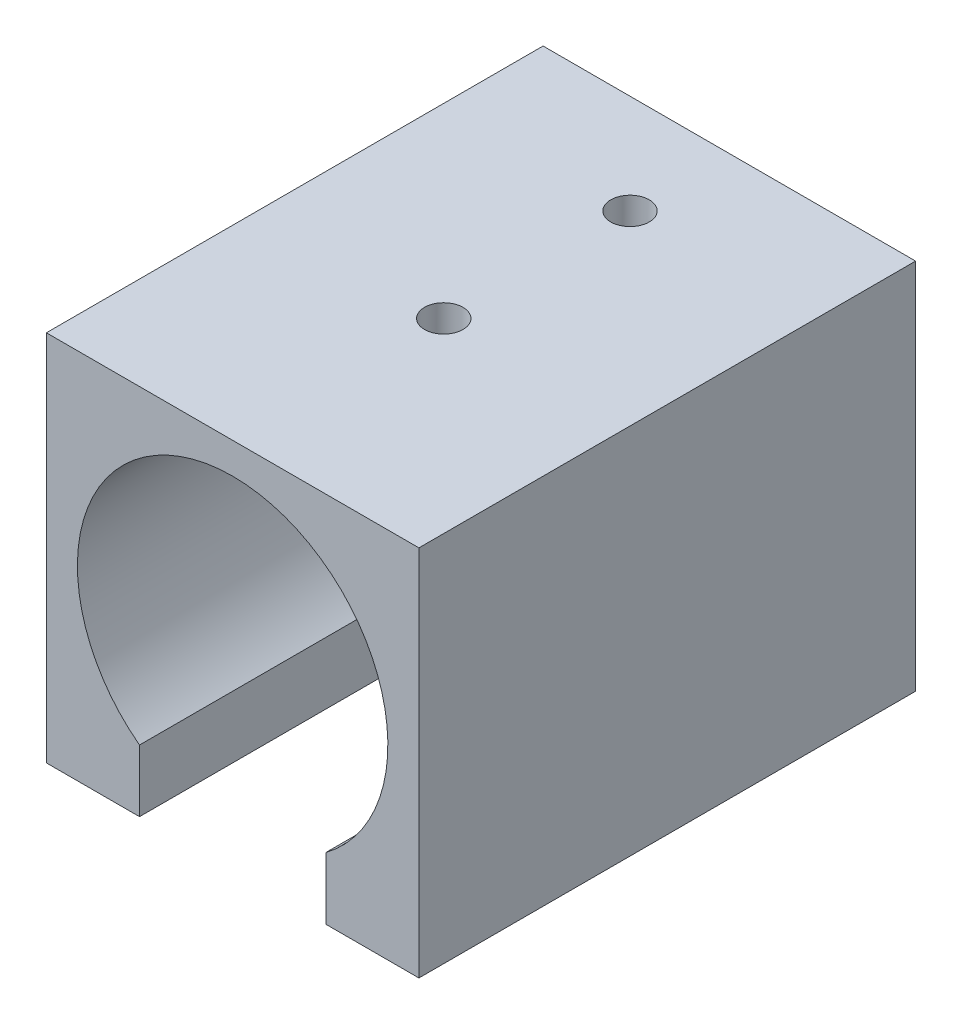
ISO-10303-21;
HEADER;
FILE_DESCRIPTION(('STEP AP214'),'2;1');
FILE_NAME('part.step','',(''),(''),'','','');
FILE_SCHEMA(('AUTOMOTIVE_DESIGN { 1 0 10303 214 1 1 1 1 }'));
ENDSEC;
DATA;
#1=APPLICATION_CONTEXT('core data for automotive mechanical design processes');
#2=APPLICATION_PROTOCOL_DEFINITION('international standard','automotive_design',2000,#1);
#3=PRODUCT_CONTEXT('',#1,'mechanical');
#4=PRODUCT('Part','Part','',(#3));
#5=PRODUCT_RELATED_PRODUCT_CATEGORY('part','',(#4));
#6=PRODUCT_DEFINITION_FORMATION('','',#4);
#7=PRODUCT_DEFINITION_CONTEXT('part definition',#1,'design');
#8=PRODUCT_DEFINITION('design','',#6,#7);
#9=PRODUCT_DEFINITION_SHAPE('','',#8);
#10=(LENGTH_UNIT() NAMED_UNIT(*) SI_UNIT(.MILLI.,.METRE.));
#11=(NAMED_UNIT(*) PLANE_ANGLE_UNIT() SI_UNIT($,.RADIAN.));
#12=(NAMED_UNIT(*) SI_UNIT($,.STERADIAN.) SOLID_ANGLE_UNIT());
#13=UNCERTAINTY_MEASURE_WITH_UNIT(LENGTH_MEASURE(1.E-05),#10,'distance_accuracy_value','');
#14=(GEOMETRIC_REPRESENTATION_CONTEXT(3) GLOBAL_UNCERTAINTY_ASSIGNED_CONTEXT((#13)) GLOBAL_UNIT_ASSIGNED_CONTEXT((#10,
#11,#12)) REPRESENTATION_CONTEXT('',''));
#15=CARTESIAN_POINT('',(0.,0.,0.));
#16=DIRECTION('',(0.,0.,1.));
#17=DIRECTION('',(1.,0.,0.));
#18=AXIS2_PLACEMENT_3D('',#15,#16,#17);
#19=CARTESIAN_POINT('',(-15.,15.,20.));
#20=DIRECTION('',(1.,0.,0.));
#21=DIRECTION('',(0.,0.,-1.));
#22=AXIS2_PLACEMENT_3D('',#19,#20,#21);
#23=PLANE('',#22);
#24=DIRECTION('',(0.,-1.,0.));
#25=VECTOR('',#24,1.);
#26=CARTESIAN_POINT('',(-15.,15.,-20.));
#27=LINE('',#26,#25);
#28=CARTESIAN_POINT('',(-15.,15.,-20.));
#29=VERTEX_POINT('',#28);
#30=CARTESIAN_POINT('',(-15.,-15.,-20.));
#31=VERTEX_POINT('',#30);
#32=EDGE_CURVE('E140',#29,#31,#27,.T.);
#33=ORIENTED_EDGE('',*,*,#32,.T.);
#34=DIRECTION('',(0.,0.,-1.));
#35=VECTOR('',#34,1.);
#36=CARTESIAN_POINT('',(-15.,-15.,20.));
#37=LINE('',#36,#35);
#38=CARTESIAN_POINT('',(-15.,-15.,20.));
#39=VERTEX_POINT('',#38);
#40=EDGE_CURVE('E11',#39,#31,#37,.T.);
#41=ORIENTED_EDGE('',*,*,#40,.F.);
#42=DIRECTION('',(0.,-1.,0.));
#43=VECTOR('',#42,1.);
#44=CARTESIAN_POINT('',(-15.,15.,20.));
#45=LINE('',#44,#43);
#46=CARTESIAN_POINT('',(-15.,15.,20.));
#47=VERTEX_POINT('',#46);
#48=EDGE_CURVE('E163',#47,#39,#45,.T.);
#49=ORIENTED_EDGE('',*,*,#48,.F.);
#50=DIRECTION('',(0.,0.,-1.));
#51=VECTOR('',#50,1.);
#52=CARTESIAN_POINT('',(-15.,15.,20.));
#53=LINE('',#52,#51);
#54=EDGE_CURVE('E136',#47,#29,#53,.T.);
#55=ORIENTED_EDGE('',*,*,#54,.T.);
#56=EDGE_LOOP('',(#33,#41,#49,#55));
#57=FACE_BOUND('',#56,.T.);
#58=ADVANCED_FACE('F39',(#57),#23,.F.);
#59=CARTESIAN_POINT('',(-15.,-15.,20.));
#60=DIRECTION('',(0.,1.,0.));
#61=DIRECTION('',(0.,0.,1.));
#62=AXIS2_PLACEMENT_3D('',#59,#60,#61);
#63=PLANE('',#62);
#64=DIRECTION('',(1.,0.,0.));
#65=VECTOR('',#64,1.);
#66=CARTESIAN_POINT('',(-15.,-15.,-20.));
#67=LINE('',#66,#65);
#68=CARTESIAN_POINT('',(-7.50000000000001,-15.,-20.));
#69=VERTEX_POINT('',#68);
#70=EDGE_CURVE('E144',#31,#69,#67,.T.);
#71=ORIENTED_EDGE('',*,*,#70,.T.);
#72=DIRECTION('',(0.,0.,-1.));
#73=VECTOR('',#72,1.);
#74=CARTESIAN_POINT('',(-7.50000000000001,-15.,20.));
#75=LINE('',#74,#73);
#76=CARTESIAN_POINT('',(-7.50000000000001,-15.,20.));
#77=VERTEX_POINT('',#76);
#78=EDGE_CURVE('E48',#77,#69,#75,.T.);
#79=ORIENTED_EDGE('',*,*,#78,.F.);
#80=DIRECTION('',(1.,0.,0.));
#81=VECTOR('',#80,1.);
#82=CARTESIAN_POINT('',(-15.,-15.,20.));
#83=LINE('',#82,#81);
#84=EDGE_CURVE('E99',#39,#77,#83,.T.);
#85=ORIENTED_EDGE('',*,*,#84,.F.);
#86=ORIENTED_EDGE('',*,*,#40,.T.);
#87=EDGE_LOOP('',(#71,#79,#85,#86));
#88=FACE_BOUND('',#87,.T.);
#89=ADVANCED_FACE('F242',(#88),#63,.F.);
#90=CARTESIAN_POINT('',(-7.50000000000001,-15.,20.));
#91=DIRECTION('',(-1.,0.,0.));
#92=DIRECTION('',(0.,0.,1.));
#93=AXIS2_PLACEMENT_3D('',#90,#91,#92);
#94=PLANE('',#93);
#95=DIRECTION('',(0.,1.,0.));
#96=VECTOR('',#95,1.);
#97=CARTESIAN_POINT('',(-7.50000000000001,-15.,-20.));
#98=LINE('',#97,#96);
#99=CARTESIAN_POINT('',(-7.50000000000001,-10.,-20.));
#100=VERTEX_POINT('',#99);
#101=EDGE_CURVE('E148',#69,#100,#98,.T.);
#102=ORIENTED_EDGE('',*,*,#101,.T.);
#103=DIRECTION('',(0.,0.,-1.));
#104=VECTOR('',#103,1.);
#105=CARTESIAN_POINT('',(-7.50000000000001,-10.,20.));
#106=LINE('',#105,#104);
#107=CARTESIAN_POINT('',(-7.50000000000001,-10.,20.));
#108=VERTEX_POINT('',#107);
#109=EDGE_CURVE('E174',#108,#100,#106,.T.);
#110=ORIENTED_EDGE('',*,*,#109,.F.);
#111=DIRECTION('',(0.,1.,0.));
#112=VECTOR('',#111,1.);
#113=CARTESIAN_POINT('',(-7.50000000000001,-15.,20.));
#114=LINE('',#113,#112);
#115=EDGE_CURVE('E184',#77,#108,#114,.T.);
#116=ORIENTED_EDGE('',*,*,#115,.F.);
#117=ORIENTED_EDGE('',*,*,#78,.T.);
#118=EDGE_LOOP('',(#102,#110,#116,#117));
#119=FACE_BOUND('',#118,.T.);
#120=ADVANCED_FACE('F182',(#119),#94,.F.);
#121=CARTESIAN_POINT('',(0.,0.,20.));
#122=DIRECTION('',(0.,0.,-1.));
#123=DIRECTION('',(-1.,0.,0.));
#124=AXIS2_PLACEMENT_3D('',#121,#122,#123);
#125=CYLINDRICAL_SURFACE('',#124,12.5);
#126=CARTESIAN_POINT('',(0.,12.5,-10.45));
#127=CARTESIAN_POINT('',(-0.0867072251236057,12.499998798212,-10.4500036870948));
#128=CARTESIAN_POINT('',(-0.173468771035089,12.4990882922832,-10.4573001512064));
#129=CARTESIAN_POINT('',(-0.344577980164189,12.495543683525,-10.4862922209141));
#130=CARTESIAN_POINT('',(-0.428923020275001,12.492907776648,-10.508002898086));
#131=CARTESIAN_POINT('',(-0.592697259859221,12.4862093415402,-10.5651742493805));
#132=CARTESIAN_POINT('',(-0.672129711980406,12.4821477694049,-10.6006257101613));
#133=CARTESIAN_POINT('',(-0.823902461956769,12.4730498401483,-10.6842522420837));
#134=CARTESIAN_POINT('',(-0.896243981963393,12.4680136514527,-10.7324251153314));
#135=CARTESIAN_POINT('',(-1.03218871664407,12.4574983294599,-10.8404062671243));
#136=CARTESIAN_POINT('',(-1.09574795593556,12.4520171708152,-10.9002697175727));
#137=CARTESIAN_POINT('',(-1.2119452218765,12.4412460183527,-11.0298142944887));
#138=CARTESIAN_POINT('',(-1.26458269424667,12.4359560342482,-11.0994959189271));
#139=CARTESIAN_POINT('',(-1.35760570049989,12.4261462119652,-11.2469841683814));
#140=CARTESIAN_POINT('',(-1.39795009322905,12.4216289816005,-11.3248169301185));
#141=CARTESIAN_POINT('',(-1.46497897354807,12.4139027656364,-11.4862183274872));
#142=CARTESIAN_POINT('',(-1.49166397105521,12.4106937312018,-11.5697867488694));
#143=CARTESIAN_POINT('',(-1.53048308042555,12.4059665430619,-11.7398311814415));
#144=CARTESIAN_POINT('',(-1.54269139131005,12.4044397699495,-11.8262900100946));
#145=CARTESIAN_POINT('',(-1.55244016467469,12.4032235756294,-12.0000417683099));
#146=CARTESIAN_POINT('',(-1.5499812079234,12.4035340816725,-12.0873346647094));
#147=CARTESIAN_POINT('',(-1.53052616632211,12.4059494750666,-12.2597597738967));
#148=CARTESIAN_POINT('',(-1.51361178336124,12.4080442773759,-12.3449013666022));
#149=CARTESIAN_POINT('',(-1.4658534859347,12.4137765003307,-12.5111282526738));
#150=CARTESIAN_POINT('',(-1.43500929335627,12.4174139517756,-12.5922134650172));
#151=CARTESIAN_POINT('',(-1.3601790085877,12.425833064832,-12.7482798820333));
#152=CARTESIAN_POINT('',(-1.316157379434,12.4306178134474,-12.8232438742211));
#153=CARTESIAN_POINT('',(-1.21624726139146,12.4407900023634,-12.9647512978054));
#154=CARTESIAN_POINT('',(-1.16035823832513,12.4461774697885,-13.0312943499416));
#155=CARTESIAN_POINT('',(-1.03784686647303,12.456992898046,-13.1545452275453));
#156=CARTESIAN_POINT('',(-0.971154089015664,12.4624208850302,-13.2111830681271));
#157=CARTESIAN_POINT('',(-0.829170957767612,12.4726714494502,-13.3124709743132));
#158=CARTESIAN_POINT('',(-0.753880584686478,12.4774940255275,-13.3571210130196));
#159=CARTESIAN_POINT('',(-0.596785749902868,12.4859933199627,-13.4331657917932));
#160=CARTESIAN_POINT('',(-0.514979163128537,12.4896696625736,-13.4645561864066));
#161=CARTESIAN_POINT('',(-0.347200470469461,12.4954588398172,-13.5131352481587));
#162=CARTESIAN_POINT('',(-0.261228556665171,12.4975717464734,-13.5303245695089));
#163=CARTESIAN_POINT('',(-0.0881648024434582,12.4999866267437,-13.5499229217329));
#164=CARTESIAN_POINT('',(-0.00108403873556593,12.5003004131844,-13.5524283677436));
#165=CARTESIAN_POINT('',(0.172256134476634,12.4991135822208,-13.5428422365252));
#166=CARTESIAN_POINT('',(0.25851556114941,12.4976130028267,-13.5307509650904));
#167=CARTESIAN_POINT('',(0.42748025585421,12.4929734205319,-13.4923947168141));
#168=CARTESIAN_POINT('',(0.510196109809588,12.4898397286542,-13.466175675375));
#169=CARTESIAN_POINT('',(0.670056755182107,12.4822847940335,-13.4003558829238));
#170=CARTESIAN_POINT('',(0.747201360078995,12.4778635082082,-13.3607546841413));
#171=CARTESIAN_POINT('',(0.89416048353398,12.4681969325582,-13.2690611822642));
#172=CARTESIAN_POINT('',(0.963935789565004,12.4629475723442,-13.2169064688757));
#173=CARTESIAN_POINT('',(1.09377679018829,12.4522248923118,-13.1016747652346));
#174=CARTESIAN_POINT('',(1.15384210555621,12.4467515637568,-13.0385973485942));
#175=CARTESIAN_POINT('',(1.26289984778849,12.4361614192701,-12.9028862493772));
#176=CARTESIAN_POINT('',(1.31182839107227,12.4310467711594,-12.8302010360302));
#177=CARTESIAN_POINT('',(1.39678244848355,12.4217886269989,-12.6775878483497));
#178=CARTESIAN_POINT('',(1.43280821778949,12.4176451117437,-12.5976600172929));
#179=CARTESIAN_POINT('',(1.49083050862598,12.41081308791,-12.4330371497684));
#180=CARTESIAN_POINT('',(1.51286313591959,12.4081208374502,-12.3483550008969));
#181=CARTESIAN_POINT('',(1.54239002807794,12.4044853964649,-12.1764574455571));
#182=CARTESIAN_POINT('',(1.54988495763164,12.4035421259731,-12.0892421550936));
#183=CARTESIAN_POINT('',(1.5501116383166,12.403513747585,-11.9153895697689));
#184=CARTESIAN_POINT('',(1.54294375248331,12.4044160075247,-11.8287523906871));
#185=CARTESIAN_POINT('',(1.514260709308,12.4079498790944,-11.6579242426086));
#186=CARTESIAN_POINT('',(1.4927455496753,12.4105814910005,-11.5737332740025));
#187=CARTESIAN_POINT('',(1.43600991652796,12.4172736604911,-11.410200084614));
#188=CARTESIAN_POINT('',(1.40079419582845,12.4213337224901,-11.3308561933805));
#189=CARTESIAN_POINT('',(1.31766697307857,12.4304261524973,-11.1791878095651));
#190=CARTESIAN_POINT('',(1.26975532197685,12.4354585319204,-11.1068633994061));
#191=CARTESIAN_POINT('',(1.16222369368404,12.4459698451891,-10.9707738899086));
#192=CARTESIAN_POINT('',(1.1025289114333,12.4514514939396,-10.9070681037375));
#193=CARTESIAN_POINT('',(0.97328131979899,12.4622196903679,-10.7905392529694));
#194=CARTESIAN_POINT('',(0.903726187955631,12.4675061917109,-10.7377187594549));
#195=CARTESIAN_POINT('',(0.756434126245411,12.477310259318,-10.6442919631966));
#196=CARTESIAN_POINT('',(0.678667539364609,12.4818248726538,-10.6037321297325));
#197=CARTESIAN_POINT('',(0.517414719236202,12.4895464811727,-10.5363050632856));
#198=CARTESIAN_POINT('',(0.433934824141751,12.4927548987956,-10.5094229273529));
#199=CARTESIAN_POINT('',(0.291684386828074,12.4967277539594,-10.476560869821));
#200=CARTESIAN_POINT('',(0.23381143027536,12.4979488792959,-10.4666148276045));
#201=CARTESIAN_POINT('',(0.117300600307159,12.4995854059513,-10.4533331692661));
#202=CARTESIAN_POINT('',(0.0586627324130275,12.500000813083,-10.4499975054552));
#203=CARTESIAN_POINT('',(0.,12.5,-10.45));
#204=B_SPLINE_CURVE_WITH_KNOTS('',3,(#126,#127,#128,#129,#130,#131,#132,#133,#134,#135,#136,
#137,#138,#139,#140,#141,#142,#143,#144,#145,#146,#147,#148,#149,#150,#151,#152,#153,#154,#155,
#156,#157,#158,#159,#160,#161,#162,#163,#164,#165,#166,#167,#168,#169,#170,#171,#172,#173,#174,
#175,#176,#177,#178,#179,#180,#181,#182,#183,#184,#185,#186,#187,#188,#189,#190,#191,#192,#193,
#194,#195,#196,#197,#198,#199,#200,#201,#202,#203),.UNSPECIFIED.,.T.,.F.,(4,2,2,2,2,2,2,2,2,2,2,
2,2,2,2,2,2,2,2,2,2,2,2,2,2,2,2,2,2,2,2,2,2,2,2,2,2,2,4),(0.,0.259907401620541,
0.520086992663462,0.780092431472956,1.04005297818175,1.30127138528092,1.56250304596413,
1.82459960187755,2.08668637278128,2.34742395283558,2.608151208732,2.86741450993791,
3.12668298764101,3.38665705917449,3.64664283519419,3.90839720179665,4.17015215570972,
4.43199282559182,4.69382143238891,4.95392891489264,5.21403094836145,5.47329233783743,
5.73256240312442,5.99314907667814,6.25374592500451,6.51580193278843,6.77785275759922,
7.0392246497426,7.30058459122419,7.5601615807523,7.81973861172431,8.07922567388976,
8.33871578259101,8.59990955754065,8.86116495535942,9.1233984713476,9.38534564768428,
9.56119014424271,9.7370333722055),.UNSPECIFIED.);
#205=CARTESIAN_POINT('',(0.,12.5,-10.45));
#206=VERTEX_POINT('',#205);
#207=EDGE_CURVE('E145',#206,#206,#204,.T.);
#208=ORIENTED_EDGE('',*,*,#207,.F.);
#209=EDGE_LOOP('',(#208));
#210=FACE_BOUND('',#209,.T.);
#211=CARTESIAN_POINT('',(0.,12.5,4.55));
#212=CARTESIAN_POINT('',(-0.0867072251236056,12.499998798212,4.54999631290523));
#213=CARTESIAN_POINT('',(-0.173468771035089,12.4990882922832,4.54269984879357));
#214=CARTESIAN_POINT('',(-0.344577980164189,12.495543683525,4.5137077790859));
#215=CARTESIAN_POINT('',(-0.428923020275002,12.492907776648,4.49199710191398));
#216=CARTESIAN_POINT('',(-0.592697259859221,12.4862093415402,4.43482575061953));
#217=CARTESIAN_POINT('',(-0.672129711980406,12.4821477694049,4.39937428983871));
#218=CARTESIAN_POINT('',(-0.823902461956769,12.4730498401483,4.31574775791625));
#219=CARTESIAN_POINT('',(-0.896243981963393,12.4680136514527,4.26757488466856));
#220=CARTESIAN_POINT('',(-1.03218871664407,12.4574983294599,4.15959373287569));
#221=CARTESIAN_POINT('',(-1.09574795593556,12.4520171708152,4.09973028242726));
#222=CARTESIAN_POINT('',(-1.2119452218765,12.4412460183527,3.97018570551125));
#223=CARTESIAN_POINT('',(-1.26458269424667,12.4359560342482,3.90050408107289));
#224=CARTESIAN_POINT('',(-1.35760570049989,12.4261462119652,3.75301583161857));
#225=CARTESIAN_POINT('',(-1.39795009322905,12.4216289816005,3.67518306988146));
#226=CARTESIAN_POINT('',(-1.46497897354807,12.4139027656364,3.51378167251279));
#227=CARTESIAN_POINT('',(-1.49166397105521,12.4106937312018,3.43021325113057));
#228=CARTESIAN_POINT('',(-1.53048308042555,12.4059665430619,3.26016881855848));
#229=CARTESIAN_POINT('',(-1.54269139131005,12.4044397699495,3.17370998990537));
#230=CARTESIAN_POINT('',(-1.55244016467469,12.4032235756294,2.99995823169012));
#231=CARTESIAN_POINT('',(-1.5499812079234,12.4035340816725,2.91266533529058));
#232=CARTESIAN_POINT('',(-1.53052616632211,12.4059494750666,2.74024022610332));
#233=CARTESIAN_POINT('',(-1.51361178336124,12.4080442773759,2.65509863339782));
#234=CARTESIAN_POINT('',(-1.4658534859347,12.4137765003307,2.48887174732621));
#235=CARTESIAN_POINT('',(-1.43500929335627,12.4174139517756,2.40778653498284));
#236=CARTESIAN_POINT('',(-1.3601790085877,12.425833064832,2.25172011796672));
#237=CARTESIAN_POINT('',(-1.316157379434,12.4306178134474,2.1767561257789));
#238=CARTESIAN_POINT('',(-1.21624726139146,12.4407900023634,2.03524870219462));
#239=CARTESIAN_POINT('',(-1.16035823832513,12.4461774697885,1.96870565005844));
#240=CARTESIAN_POINT('',(-1.03784686647303,12.456992898046,1.84545477245472));
#241=CARTESIAN_POINT('',(-0.971154089015663,12.4624208850302,1.78881693187286));
#242=CARTESIAN_POINT('',(-0.829170957767611,12.4726714494502,1.68752902568678));
#243=CARTESIAN_POINT('',(-0.753880584686478,12.4774940255275,1.64287898698037));
#244=CARTESIAN_POINT('',(-0.596785749902867,12.4859933199627,1.56683420820677));
#245=CARTESIAN_POINT('',(-0.514979163128537,12.4896696625736,1.53544381359335));
#246=CARTESIAN_POINT('',(-0.34720047046946,12.4954588398172,1.48686475184133));
#247=CARTESIAN_POINT('',(-0.26122855666517,12.4975717464734,1.46967543049114));
#248=CARTESIAN_POINT('',(-0.0881648024434575,12.4999866267437,1.45007707826711));
#249=CARTESIAN_POINT('',(-0.00108403873556553,12.5003004131844,1.4475716322564));
#250=CARTESIAN_POINT('',(0.172256134476634,12.4991135822208,1.45715776347481));
#251=CARTESIAN_POINT('',(0.258515561149411,12.4976130028267,1.46924903490957));
#252=CARTESIAN_POINT('',(0.42748025585421,12.4929734205319,1.50760528318592));
#253=CARTESIAN_POINT('',(0.510196109809588,12.4898397286542,1.53382432462502));
#254=CARTESIAN_POINT('',(0.670056755182108,12.4822847940335,1.59964411707623));
#255=CARTESIAN_POINT('',(0.747201360078996,12.4778635082082,1.63924531585874));
#256=CARTESIAN_POINT('',(0.89416048353398,12.4681969325582,1.73093881773578));
#257=CARTESIAN_POINT('',(0.963935789565004,12.4629475723442,1.7830935311243));
#258=CARTESIAN_POINT('',(1.09377679018829,12.4522248923118,1.89832523476544));
#259=CARTESIAN_POINT('',(1.15384210555621,12.4467515637568,1.96140265140581));
#260=CARTESIAN_POINT('',(1.26289984778849,12.4361614192701,2.0971137506228));
#261=CARTESIAN_POINT('',(1.31182839107227,12.4310467711594,2.16979896396984));
#262=CARTESIAN_POINT('',(1.39678244848356,12.4217886269989,2.32241215165026));
#263=CARTESIAN_POINT('',(1.43280821778949,12.4176451117437,2.40233998270706));
#264=CARTESIAN_POINT('',(1.49083050862598,12.41081308791,2.56696285023156));
#265=CARTESIAN_POINT('',(1.51286313591959,12.4081208374502,2.6516449991031));
#266=CARTESIAN_POINT('',(1.54239002807794,12.4044853964649,2.82354255444287));
#267=CARTESIAN_POINT('',(1.54988495763164,12.4035421259731,2.91075784490637));
#268=CARTESIAN_POINT('',(1.5501116383166,12.403513747585,3.08461043023106));
#269=CARTESIAN_POINT('',(1.54294375248331,12.4044160075247,3.17124760931287));
#270=CARTESIAN_POINT('',(1.514260709308,12.4079498790944,3.34207575739137));
#271=CARTESIAN_POINT('',(1.4927455496753,12.4105814910005,3.4262667259975));
#272=CARTESIAN_POINT('',(1.43600991652796,12.4172736604911,3.58979991538602));
#273=CARTESIAN_POINT('',(1.40079419582845,12.4213337224901,3.6691438066195));
#274=CARTESIAN_POINT('',(1.31766697307856,12.4304261524973,3.8208121904349));
#275=CARTESIAN_POINT('',(1.26975532197685,12.4354585319204,3.89313660059388));
#276=CARTESIAN_POINT('',(1.16222369368404,12.4459698451891,4.02922611009145));
#277=CARTESIAN_POINT('',(1.1025289114333,12.4514514939396,4.09293189626252));
#278=CARTESIAN_POINT('',(0.973281319798991,12.4622196903679,4.20946074703056));
#279=CARTESIAN_POINT('',(0.903726187955631,12.4675061917109,4.26228124054513));
#280=CARTESIAN_POINT('',(0.756434126245411,12.477310259318,4.35570803680339));
#281=CARTESIAN_POINT('',(0.678667539364608,12.4818248726538,4.39626787026746));
#282=CARTESIAN_POINT('',(0.517414719236201,12.4895464811727,4.46369493671438));
#283=CARTESIAN_POINT('',(0.43393482414175,12.4927548987956,4.49057707264711));
#284=CARTESIAN_POINT('',(0.291684386828073,12.4967277539594,4.52343913017896));
#285=CARTESIAN_POINT('',(0.23381143027536,12.4979488792959,4.53338517239551));
#286=CARTESIAN_POINT('',(0.11730060030716,12.4995854059513,4.54666683073386));
#287=CARTESIAN_POINT('',(0.0586627324130277,12.500000813083,4.55000249454476));
#288=CARTESIAN_POINT('',(0.,12.5,4.55));
#289=B_SPLINE_CURVE_WITH_KNOTS('',3,(#211,#212,#213,#214,#215,#216,#217,#218,#219,#220,#221,
#222,#223,#224,#225,#226,#227,#228,#229,#230,#231,#232,#233,#234,#235,#236,#237,#238,#239,#240,
#241,#242,#243,#244,#245,#246,#247,#248,#249,#250,#251,#252,#253,#254,#255,#256,#257,#258,#259,
#260,#261,#262,#263,#264,#265,#266,#267,#268,#269,#270,#271,#272,#273,#274,#275,#276,#277,#278,
#279,#280,#281,#282,#283,#284,#285,#286,#287,#288),.UNSPECIFIED.,.T.,.F.,(4,2,2,2,2,2,2,2,2,2,2,
2,2,2,2,2,2,2,2,2,2,2,2,2,2,2,2,2,2,2,2,2,2,2,2,2,2,2,4),(0.,0.25990740162054,0.520086992663463,
0.780092431472957,1.04005297818175,1.30127138528093,1.56250304596414,1.82459960187755,
2.08668637278128,2.34742395283558,2.608151208732,2.86741450993791,3.12668298764101,
3.38665705917449,3.64664283519419,3.90839720179665,4.17015215570972,4.43199282559182,
4.69382143238891,4.95392891489264,5.21403094836145,5.47329233783743,5.73256240312442,
5.99314907667814,6.25374592500452,6.51580193278843,6.77785275759923,7.03922464974261,
7.30058459122419,7.5601615807523,7.81973861172431,8.07922567388977,8.33871578259101,
8.59990955754065,8.86116495535942,9.1233984713476,9.38534564768428,9.56119014424271,
9.7370333722055),.UNSPECIFIED.);
#290=CARTESIAN_POINT('',(0.,12.5,4.55));
#291=VERTEX_POINT('',#290);
#292=EDGE_CURVE('E207',#291,#291,#289,.T.);
#293=ORIENTED_EDGE('',*,*,#292,.F.);
#294=EDGE_LOOP('',(#293));
#295=FACE_BOUND('',#294,.T.);
#296=CARTESIAN_POINT('',(0.,0.,-20.));
#297=DIRECTION('',(0.,0.,-1.));
#298=DIRECTION('',(-1.,0.,0.));
#299=AXIS2_PLACEMENT_3D('',#296,#297,#298);
#300=CIRCLE('',#299,12.5);
#301=CARTESIAN_POINT('',(7.50000000000001,-10.,-20.));
#302=VERTEX_POINT('',#301);
#303=EDGE_CURVE('E151',#100,#302,#300,.T.);
#304=ORIENTED_EDGE('',*,*,#303,.T.);
#305=DIRECTION('',(0.,0.,-1.));
#306=VECTOR('',#305,1.);
#307=CARTESIAN_POINT('',(7.50000000000001,-10.,20.));
#308=LINE('',#307,#306);
#309=CARTESIAN_POINT('',(7.50000000000001,-10.,20.));
#310=VERTEX_POINT('',#309);
#311=EDGE_CURVE('E170',#310,#302,#308,.T.);
#312=ORIENTED_EDGE('',*,*,#311,.F.);
#313=CARTESIAN_POINT('',(0.,0.,20.));
#314=DIRECTION('',(0.,0.,-1.));
#315=DIRECTION('',(-1.,0.,0.));
#316=AXIS2_PLACEMENT_3D('',#313,#314,#315);
#317=CIRCLE('',#316,12.5);
#318=EDGE_CURVE('E197',#108,#310,#317,.T.);
#319=ORIENTED_EDGE('',*,*,#318,.F.);
#320=ORIENTED_EDGE('',*,*,#109,.T.);
#321=EDGE_LOOP('',(#304,#312,#319,#320));
#322=FACE_BOUND('',#321,.T.);
#323=ADVANCED_FACE('F192',(#210,#295,#322),#125,.F.);
#324=CARTESIAN_POINT('',(7.50000000000001,-15.,20.));
#325=DIRECTION('',(1.,0.,0.));
#326=DIRECTION('',(0.,0.,-1.));
#327=AXIS2_PLACEMENT_3D('',#324,#325,#326);
#328=PLANE('',#327);
#329=DIRECTION('',(0.,-1.,0.));
#330=VECTOR('',#329,1.);
#331=CARTESIAN_POINT('',(7.50000000000001,-15.,-20.));
#332=LINE('',#331,#330);
#333=CARTESIAN_POINT('',(7.50000000000001,-15.,-20.));
#334=VERTEX_POINT('',#333);
#335=EDGE_CURVE('E154',#302,#334,#332,.T.);
#336=ORIENTED_EDGE('',*,*,#335,.T.);
#337=DIRECTION('',(0.,0.,-1.));
#338=VECTOR('',#337,1.);
#339=CARTESIAN_POINT('',(7.50000000000001,-15.,20.));
#340=LINE('',#339,#338);
#341=CARTESIAN_POINT('',(7.50000000000001,-15.,20.));
#342=VERTEX_POINT('',#341);
#343=EDGE_CURVE('E129',#342,#334,#340,.T.);
#344=ORIENTED_EDGE('',*,*,#343,.F.);
#345=DIRECTION('',(0.,-1.,0.));
#346=VECTOR('',#345,1.);
#347=CARTESIAN_POINT('',(7.50000000000001,-15.,20.));
#348=LINE('',#347,#346);
#349=EDGE_CURVE('E118',#310,#342,#348,.T.);
#350=ORIENTED_EDGE('',*,*,#349,.F.);
#351=ORIENTED_EDGE('',*,*,#311,.T.);
#352=EDGE_LOOP('',(#336,#344,#350,#351));
#353=FACE_BOUND('',#352,.T.);
#354=ADVANCED_FACE('F195',(#353),#328,.F.);
#355=CARTESIAN_POINT('',(15.,-15.,20.));
#356=DIRECTION('',(0.,1.,0.));
#357=DIRECTION('',(0.,0.,1.));
#358=AXIS2_PLACEMENT_3D('',#355,#356,#357);
#359=PLANE('',#358);
#360=DIRECTION('',(1.,0.,0.));
#361=VECTOR('',#360,1.);
#362=CARTESIAN_POINT('',(15.,-15.,-20.));
#363=LINE('',#362,#361);
#364=CARTESIAN_POINT('',(15.,-15.,-20.));
#365=VERTEX_POINT('',#364);
#366=EDGE_CURVE('E127',#334,#365,#363,.T.);
#367=ORIENTED_EDGE('',*,*,#366,.T.);
#368=DIRECTION('',(0.,0.,-1.));
#369=VECTOR('',#368,1.);
#370=CARTESIAN_POINT('',(15.,-15.,20.));
#371=LINE('',#370,#369);
#372=CARTESIAN_POINT('',(15.,-15.,20.));
#373=VERTEX_POINT('',#372);
#374=EDGE_CURVE('E124',#373,#365,#371,.T.);
#375=ORIENTED_EDGE('',*,*,#374,.F.);
#376=DIRECTION('',(1.,0.,0.));
#377=VECTOR('',#376,1.);
#378=CARTESIAN_POINT('',(15.,-15.,20.));
#379=LINE('',#378,#377);
#380=EDGE_CURVE('E112',#342,#373,#379,.T.);
#381=ORIENTED_EDGE('',*,*,#380,.F.);
#382=ORIENTED_EDGE('',*,*,#343,.T.);
#383=EDGE_LOOP('',(#367,#375,#381,#382));
#384=FACE_BOUND('',#383,.T.);
#385=ADVANCED_FACE('F125',(#384),#359,.F.);
#386=CARTESIAN_POINT('',(15.,15.,20.));
#387=DIRECTION('',(-1.,0.,0.));
#388=DIRECTION('',(0.,0.,1.));
#389=AXIS2_PLACEMENT_3D('',#386,#387,#388);
#390=PLANE('',#389);
#391=DIRECTION('',(0.,1.,0.));
#392=VECTOR('',#391,1.);
#393=CARTESIAN_POINT('',(15.,15.,-20.));
#394=LINE('',#393,#392);
#395=CARTESIAN_POINT('',(15.,15.,-20.));
#396=VERTEX_POINT('',#395);
#397=EDGE_CURVE('E85',#365,#396,#394,.T.);
#398=ORIENTED_EDGE('',*,*,#397,.T.);
#399=DIRECTION('',(0.,0.,-1.));
#400=VECTOR('',#399,1.);
#401=CARTESIAN_POINT('',(15.,15.,20.));
#402=LINE('',#401,#400);
#403=CARTESIAN_POINT('',(15.,15.,20.));
#404=VERTEX_POINT('',#403);
#405=EDGE_CURVE('E130',#404,#396,#402,.T.);
#406=ORIENTED_EDGE('',*,*,#405,.F.);
#407=DIRECTION('',(0.,1.,0.));
#408=VECTOR('',#407,1.);
#409=CARTESIAN_POINT('',(15.,15.,20.));
#410=LINE('',#409,#408);
#411=EDGE_CURVE('E116',#373,#404,#410,.T.);
#412=ORIENTED_EDGE('',*,*,#411,.F.);
#413=ORIENTED_EDGE('',*,*,#374,.T.);
#414=EDGE_LOOP('',(#398,#406,#412,#413));
#415=FACE_BOUND('',#414,.T.);
#416=ADVANCED_FACE('F132',(#415),#390,.F.);
#417=CARTESIAN_POINT('',(-15.,15.,20.));
#418=DIRECTION('',(0.,-1.,0.));
#419=DIRECTION('',(0.,0.,-1.));
#420=AXIS2_PLACEMENT_3D('',#417,#418,#419);
#421=PLANE('',#420);
#422=CARTESIAN_POINT('',(0.,15.,-12.));
#423=DIRECTION('',(0.,1.,0.));
#424=DIRECTION('',(0.,0.,1.));
#425=AXIS2_PLACEMENT_3D('',#422,#423,#424);
#426=CIRCLE('',#425,1.55);
#427=CARTESIAN_POINT('',(0.,15.,-10.45));
#428=VERTEX_POINT('',#427);
#429=EDGE_CURVE('E216',#428,#428,#426,.T.);
#430=ORIENTED_EDGE('',*,*,#429,.F.);
#431=EDGE_LOOP('',(#430));
#432=FACE_BOUND('',#431,.T.);
#433=CARTESIAN_POINT('',(0.,15.,3.));
#434=DIRECTION('',(0.,1.,0.));
#435=DIRECTION('',(0.,0.,1.));
#436=AXIS2_PLACEMENT_3D('',#433,#434,#435);
#437=CIRCLE('',#436,1.55);
#438=CARTESIAN_POINT('',(0.,15.,4.55));
#439=VERTEX_POINT('',#438);
#440=EDGE_CURVE('E217',#439,#439,#437,.T.);
#441=ORIENTED_EDGE('',*,*,#440,.F.);
#442=EDGE_LOOP('',(#441));
#443=FACE_BOUND('',#442,.T.);
#444=DIRECTION('',(-1.,0.,0.));
#445=VECTOR('',#444,1.);
#446=CARTESIAN_POINT('',(-15.,15.,-20.));
#447=LINE('',#446,#445);
#448=EDGE_CURVE('E91',#396,#29,#447,.T.);
#449=ORIENTED_EDGE('',*,*,#448,.T.);
#450=ORIENTED_EDGE('',*,*,#54,.F.);
#451=DIRECTION('',(-1.,0.,0.));
#452=VECTOR('',#451,1.);
#453=CARTESIAN_POINT('',(-15.,15.,20.));
#454=LINE('',#453,#452);
#455=EDGE_CURVE('E56',#404,#47,#454,.T.);
#456=ORIENTED_EDGE('',*,*,#455,.F.);
#457=ORIENTED_EDGE('',*,*,#405,.T.);
#458=EDGE_LOOP('',(#449,#450,#456,#457));
#459=FACE_BOUND('',#458,.T.);
#460=ADVANCED_FACE('F226',(#432,#443,#459),#421,.F.);
#461=CARTESIAN_POINT('',(0.,0.,20.));
#462=DIRECTION('',(0.,0.,-1.));
#463=DIRECTION('',(-1.,0.,0.));
#464=AXIS2_PLACEMENT_3D('',#461,#462,#463);
#465=PLANE('',#464);
#466=ORIENTED_EDGE('',*,*,#48,.T.);
#467=ORIENTED_EDGE('',*,*,#84,.T.);
#468=ORIENTED_EDGE('',*,*,#115,.T.);
#469=ORIENTED_EDGE('',*,*,#318,.T.);
#470=ORIENTED_EDGE('',*,*,#349,.T.);
#471=ORIENTED_EDGE('',*,*,#380,.T.);
#472=ORIENTED_EDGE('',*,*,#411,.T.);
#473=ORIENTED_EDGE('',*,*,#455,.T.);
#474=EDGE_LOOP('',(#466,#467,#468,#469,#470,#471,#472,#473));
#475=FACE_BOUND('',#474,.T.);
#476=ADVANCED_FACE('F114',(#475),#465,.F.);
#477=CARTESIAN_POINT('',(0.,0.,-20.));
#478=DIRECTION('',(0.,0.,-1.));
#479=DIRECTION('',(-1.,0.,0.));
#480=AXIS2_PLACEMENT_3D('',#477,#478,#479);
#481=PLANE('',#480);
#482=ORIENTED_EDGE('',*,*,#32,.F.);
#483=ORIENTED_EDGE('',*,*,#448,.F.);
#484=ORIENTED_EDGE('',*,*,#397,.F.);
#485=ORIENTED_EDGE('',*,*,#366,.F.);
#486=ORIENTED_EDGE('',*,*,#335,.F.);
#487=ORIENTED_EDGE('',*,*,#303,.F.);
#488=ORIENTED_EDGE('',*,*,#101,.F.);
#489=ORIENTED_EDGE('',*,*,#70,.F.);
#490=EDGE_LOOP('',(#482,#483,#484,#485,#486,#487,#488,#489));
#491=FACE_BOUND('',#490,.T.);
#492=ADVANCED_FACE('F188',(#491),#481,.T.);
#493=CARTESIAN_POINT('',(0.,-15.001,3.));
#494=DIRECTION('',(0.,1.,0.));
#495=DIRECTION('',(0.,0.,1.));
#496=AXIS2_PLACEMENT_3D('',#493,#494,#495);
#497=CYLINDRICAL_SURFACE('',#496,1.55);
#498=ORIENTED_EDGE('',*,*,#292,.T.);
#499=EDGE_LOOP('',(#498));
#500=FACE_BOUND('',#499,.T.);
#501=ORIENTED_EDGE('',*,*,#440,.T.);
#502=EDGE_LOOP('',(#501));
#503=FACE_BOUND('',#502,.T.);
#504=ADVANCED_FACE('F219',(#500,#503),#497,.F.);
#505=CARTESIAN_POINT('',(0.,-15.001,-12.));
#506=DIRECTION('',(0.,1.,0.));
#507=DIRECTION('',(0.,0.,1.));
#508=AXIS2_PLACEMENT_3D('',#505,#506,#507);
#509=CYLINDRICAL_SURFACE('',#508,1.55);
#510=ORIENTED_EDGE('',*,*,#207,.T.);
#511=EDGE_LOOP('',(#510));
#512=FACE_BOUND('',#511,.T.);
#513=ORIENTED_EDGE('',*,*,#429,.T.);
#514=EDGE_LOOP('',(#513));
#515=FACE_BOUND('',#514,.T.);
#516=ADVANCED_FACE('F313',(#512,#515),#509,.F.);
#517=CLOSED_SHELL('',(#58,#89,#120,#323,#354,#385,#416,#460,#476,#492,#504,#516));
#518=MANIFOLD_SOLID_BREP('B2',#517);
#519=ADVANCED_BREP_SHAPE_REPRESENTATION('',(#18,#518),#14);
#520=SHAPE_DEFINITION_REPRESENTATION(#9,#519);
ENDSEC;
END-ISO-10303-21;
